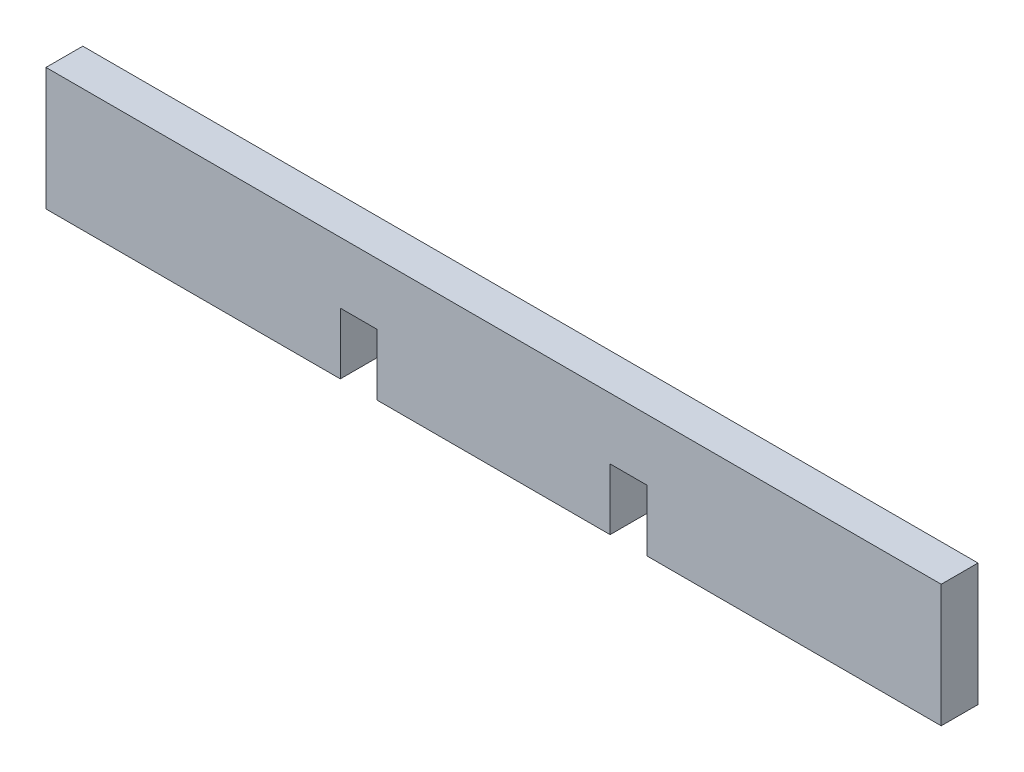
ISO-10303-21;
HEADER;
FILE_DESCRIPTION(('STEP AP214'),'2;1');
FILE_NAME('part.step','',(''),(''),'','','');
FILE_SCHEMA(('AUTOMOTIVE_DESIGN { 1 0 10303 214 1 1 1 1 }'));
ENDSEC;
DATA;
#1=APPLICATION_CONTEXT('core data for automotive mechanical design processes');
#2=APPLICATION_PROTOCOL_DEFINITION('international standard','automotive_design',2000,#1);
#3=PRODUCT_CONTEXT('',#1,'mechanical');
#4=PRODUCT('Part','Part','',(#3));
#5=PRODUCT_RELATED_PRODUCT_CATEGORY('part','',(#4));
#6=PRODUCT_DEFINITION_FORMATION('','',#4);
#7=PRODUCT_DEFINITION_CONTEXT('part definition',#1,'design');
#8=PRODUCT_DEFINITION('design','',#6,#7);
#9=PRODUCT_DEFINITION_SHAPE('','',#8);
#10=(LENGTH_UNIT() NAMED_UNIT(*) SI_UNIT(.MILLI.,.METRE.));
#11=(NAMED_UNIT(*) PLANE_ANGLE_UNIT() SI_UNIT($,.RADIAN.));
#12=(NAMED_UNIT(*) SI_UNIT($,.STERADIAN.) SOLID_ANGLE_UNIT());
#13=UNCERTAINTY_MEASURE_WITH_UNIT(LENGTH_MEASURE(1.E-05),#10,'distance_accuracy_value','');
#14=(GEOMETRIC_REPRESENTATION_CONTEXT(3) GLOBAL_UNCERTAINTY_ASSIGNED_CONTEXT((#13)) GLOBAL_UNIT_ASSIGNED_CONTEXT((#10,
#11,#12)) REPRESENTATION_CONTEXT('',''));
#15=CARTESIAN_POINT('',(0.,0.,0.));
#16=DIRECTION('',(0.,0.,1.));
#17=DIRECTION('',(1.,0.,0.));
#18=AXIS2_PLACEMENT_3D('',#15,#16,#17);
#19=CARTESIAN_POINT('',(-4.09230769230768,0.,3.));
#20=DIRECTION('',(0.,1.,0.));
#21=DIRECTION('',(0.,0.,1.));
#22=AXIS2_PLACEMENT_3D('',#19,#20,#21);
#23=PLANE('',#22);
#24=DIRECTION('',(1.,0.,0.));
#25=VECTOR('',#24,1.);
#26=CARTESIAN_POINT('',(-4.09230769230768,0.,0.));
#27=LINE('',#26,#25);
#28=CARTESIAN_POINT('',(-13.15,0.,0.));
#29=VERTEX_POINT('',#28);
#30=CARTESIAN_POINT('',(5.85,0.,0.));
#31=VERTEX_POINT('',#30);
#32=EDGE_CURVE('E101',#29,#31,#27,.T.);
#33=ORIENTED_EDGE('',*,*,#32,.T.);
#34=DIRECTION('',(0.,0.,-1.));
#35=VECTOR('',#34,1.);
#36=CARTESIAN_POINT('',(5.85,0.,3.));
#37=LINE('',#36,#35);
#38=CARTESIAN_POINT('',(5.85,0.,3.));
#39=VERTEX_POINT('',#38);
#40=EDGE_CURVE('E11',#39,#31,#37,.T.);
#41=ORIENTED_EDGE('',*,*,#40,.F.);
#42=DIRECTION('',(1.,0.,0.));
#43=VECTOR('',#42,1.);
#44=CARTESIAN_POINT('',(-13.15,0.,3.));
#45=LINE('',#44,#43);
#46=CARTESIAN_POINT('',(-13.15,0.,3.));
#47=VERTEX_POINT('',#46);
#48=EDGE_CURVE('E107',#47,#39,#45,.T.);
#49=ORIENTED_EDGE('',*,*,#48,.F.);
#50=DIRECTION('',(0.,0.,-1.));
#51=VECTOR('',#50,1.);
#52=CARTESIAN_POINT('',(-13.15,0.,3.));
#53=LINE('',#52,#51);
#54=EDGE_CURVE('E153',#47,#29,#53,.T.);
#55=ORIENTED_EDGE('',*,*,#54,.T.);
#56=EDGE_LOOP('',(#33,#41,#49,#55));
#57=FACE_BOUND('',#56,.T.);
#58=ADVANCED_FACE('F37',(#57),#23,.F.);
#59=CARTESIAN_POINT('',(5.85,0.,3.));
#60=DIRECTION('',(-1.,0.,0.));
#61=DIRECTION('',(0.,-1.,0.));
#62=AXIS2_PLACEMENT_3D('',#59,#60,#61);
#63=PLANE('',#62);
#64=DIRECTION('',(0.,1.,0.));
#65=VECTOR('',#64,1.);
#66=CARTESIAN_POINT('',(5.85,0.,0.));
#67=LINE('',#66,#65);
#68=CARTESIAN_POINT('',(5.85,5.00000000000001,0.));
#69=VERTEX_POINT('',#68);
#70=EDGE_CURVE('E158',#31,#69,#67,.T.);
#71=ORIENTED_EDGE('',*,*,#70,.T.);
#72=DIRECTION('',(0.,0.,-1.));
#73=VECTOR('',#72,1.);
#74=CARTESIAN_POINT('',(5.85,5.00000000000001,3.));
#75=LINE('',#74,#73);
#76=CARTESIAN_POINT('',(5.85,5.00000000000001,3.));
#77=VERTEX_POINT('',#76);
#78=EDGE_CURVE('E45',#77,#69,#75,.T.);
#79=ORIENTED_EDGE('',*,*,#78,.F.);
#80=DIRECTION('',(0.,1.,0.));
#81=VECTOR('',#80,1.);
#82=CARTESIAN_POINT('',(5.85,0.,3.));
#83=LINE('',#82,#81);
#84=EDGE_CURVE('E246',#39,#77,#83,.T.);
#85=ORIENTED_EDGE('',*,*,#84,.F.);
#86=ORIENTED_EDGE('',*,*,#40,.T.);
#87=EDGE_LOOP('',(#71,#79,#85,#86));
#88=FACE_BOUND('',#87,.T.);
#89=ADVANCED_FACE('F249',(#88),#63,.F.);
#90=CARTESIAN_POINT('',(5.85,5.00000000000001,3.));
#91=DIRECTION('',(0.,1.,0.));
#92=DIRECTION('',(0.,0.,1.));
#93=AXIS2_PLACEMENT_3D('',#90,#91,#92);
#94=PLANE('',#93);
#95=DIRECTION('',(1.,0.,0.));
#96=VECTOR('',#95,1.);
#97=CARTESIAN_POINT('',(5.85,5.00000000000001,0.));
#98=LINE('',#97,#96);
#99=CARTESIAN_POINT('',(8.85,5.00000000000001,0.));
#100=VERTEX_POINT('',#99);
#101=EDGE_CURVE('E160',#69,#100,#98,.T.);
#102=ORIENTED_EDGE('',*,*,#101,.T.);
#103=DIRECTION('',(0.,0.,-1.));
#104=VECTOR('',#103,1.);
#105=CARTESIAN_POINT('',(8.85,5.00000000000001,3.));
#106=LINE('',#105,#104);
#107=CARTESIAN_POINT('',(8.85,5.00000000000001,3.));
#108=VERTEX_POINT('',#107);
#109=EDGE_CURVE('E197',#108,#100,#106,.T.);
#110=ORIENTED_EDGE('',*,*,#109,.F.);
#111=DIRECTION('',(1.,0.,0.));
#112=VECTOR('',#111,1.);
#113=CARTESIAN_POINT('',(5.85,5.00000000000001,3.));
#114=LINE('',#113,#112);
#115=EDGE_CURVE('E206',#77,#108,#114,.T.);
#116=ORIENTED_EDGE('',*,*,#115,.F.);
#117=ORIENTED_EDGE('',*,*,#78,.T.);
#118=EDGE_LOOP('',(#102,#110,#116,#117));
#119=FACE_BOUND('',#118,.T.);
#120=ADVANCED_FACE('F204',(#119),#94,.F.);
#121=CARTESIAN_POINT('',(8.85,5.00000000000001,3.));
#122=DIRECTION('',(1.,0.,0.));
#123=DIRECTION('',(0.,1.,0.));
#124=AXIS2_PLACEMENT_3D('',#121,#122,#123);
#125=PLANE('',#124);
#126=DIRECTION('',(0.,-1.,0.));
#127=VECTOR('',#126,1.);
#128=CARTESIAN_POINT('',(8.85,5.00000000000001,0.));
#129=LINE('',#128,#127);
#130=CARTESIAN_POINT('',(8.85,0.,0.));
#131=VERTEX_POINT('',#130);
#132=EDGE_CURVE('E162',#100,#131,#129,.T.);
#133=ORIENTED_EDGE('',*,*,#132,.T.);
#134=DIRECTION('',(0.,0.,-1.));
#135=VECTOR('',#134,1.);
#136=CARTESIAN_POINT('',(8.85,0.,3.));
#137=LINE('',#136,#135);
#138=CARTESIAN_POINT('',(8.85,0.,3.));
#139=VERTEX_POINT('',#138);
#140=EDGE_CURVE('E194',#139,#131,#137,.T.);
#141=ORIENTED_EDGE('',*,*,#140,.F.);
#142=DIRECTION('',(0.,-1.,0.));
#143=VECTOR('',#142,1.);
#144=CARTESIAN_POINT('',(8.85,5.00000000000001,3.));
#145=LINE('',#144,#143);
#146=EDGE_CURVE('E224',#108,#139,#145,.T.);
#147=ORIENTED_EDGE('',*,*,#146,.F.);
#148=ORIENTED_EDGE('',*,*,#109,.T.);
#149=EDGE_LOOP('',(#133,#141,#147,#148));
#150=FACE_BOUND('',#149,.T.);
#151=ADVANCED_FACE('F215',(#150),#125,.F.);
#152=CARTESIAN_POINT('',(8.85,0.,3.));
#153=DIRECTION('',(0.,1.,0.));
#154=DIRECTION('',(-1.,0.,0.));
#155=AXIS2_PLACEMENT_3D('',#152,#153,#154);
#156=PLANE('',#155);
#157=DIRECTION('',(1.,0.,0.));
#158=VECTOR('',#157,1.);
#159=CARTESIAN_POINT('',(8.85,0.,0.));
#160=LINE('',#159,#158);
#161=CARTESIAN_POINT('',(32.85,0.,0.));
#162=VERTEX_POINT('',#161);
#163=EDGE_CURVE('E164',#131,#162,#160,.T.);
#164=ORIENTED_EDGE('',*,*,#163,.T.);
#165=DIRECTION('',(0.,0.,-1.));
#166=VECTOR('',#165,1.);
#167=CARTESIAN_POINT('',(32.85,0.,3.));
#168=LINE('',#167,#166);
#169=CARTESIAN_POINT('',(32.85,0.,3.));
#170=VERTEX_POINT('',#169);
#171=EDGE_CURVE('E191',#170,#162,#168,.T.);
#172=ORIENTED_EDGE('',*,*,#171,.F.);
#173=DIRECTION('',(1.,0.,0.));
#174=VECTOR('',#173,1.);
#175=CARTESIAN_POINT('',(8.85,0.,3.));
#176=LINE('',#175,#174);
#177=EDGE_CURVE('E221',#139,#170,#176,.T.);
#178=ORIENTED_EDGE('',*,*,#177,.F.);
#179=ORIENTED_EDGE('',*,*,#140,.T.);
#180=EDGE_LOOP('',(#164,#172,#178,#179));
#181=FACE_BOUND('',#180,.T.);
#182=ADVANCED_FACE('F219',(#181),#156,.F.);
#183=CARTESIAN_POINT('',(32.85,0.,3.));
#184=DIRECTION('',(-1.,0.,0.));
#185=DIRECTION('',(0.,0.,1.));
#186=AXIS2_PLACEMENT_3D('',#183,#184,#185);
#187=PLANE('',#186);
#188=DIRECTION('',(0.,1.,0.));
#189=VECTOR('',#188,1.);
#190=CARTESIAN_POINT('',(32.85,0.,0.));
#191=LINE('',#190,#189);
#192=CARTESIAN_POINT('',(32.85,10.,0.));
#193=VERTEX_POINT('',#192);
#194=EDGE_CURVE('E166',#162,#193,#191,.T.);
#195=ORIENTED_EDGE('',*,*,#194,.T.);
#196=DIRECTION('',(0.,0.,-1.));
#197=VECTOR('',#196,1.);
#198=CARTESIAN_POINT('',(32.85,10.,3.));
#199=LINE('',#198,#197);
#200=CARTESIAN_POINT('',(32.85,10.,3.));
#201=VERTEX_POINT('',#200);
#202=EDGE_CURVE('E188',#201,#193,#199,.T.);
#203=ORIENTED_EDGE('',*,*,#202,.F.);
#204=DIRECTION('',(0.,1.,0.));
#205=VECTOR('',#204,1.);
#206=CARTESIAN_POINT('',(32.85,0.,3.));
#207=LINE('',#206,#205);
#208=EDGE_CURVE('E223',#170,#201,#207,.T.);
#209=ORIENTED_EDGE('',*,*,#208,.F.);
#210=ORIENTED_EDGE('',*,*,#171,.T.);
#211=EDGE_LOOP('',(#195,#203,#209,#210));
#212=FACE_BOUND('',#211,.T.);
#213=ADVANCED_FACE('F261',(#212),#187,.F.);
#214=CARTESIAN_POINT('',(32.85,10.,3.));
#215=DIRECTION('',(0.,-1.,0.));
#216=DIRECTION('',(1.,0.,0.));
#217=AXIS2_PLACEMENT_3D('',#214,#215,#216);
#218=PLANE('',#217);
#219=DIRECTION('',(-1.,0.,0.));
#220=VECTOR('',#219,1.);
#221=CARTESIAN_POINT('',(32.85,10.,0.));
#222=LINE('',#221,#220);
#223=CARTESIAN_POINT('',(-40.15,9.99999999999999,0.));
#224=VERTEX_POINT('',#223);
#225=EDGE_CURVE('E168',#193,#224,#222,.T.);
#226=ORIENTED_EDGE('',*,*,#225,.T.);
#227=DIRECTION('',(0.,0.,-1.));
#228=VECTOR('',#227,1.);
#229=CARTESIAN_POINT('',(-40.15,9.99999999999999,3.));
#230=LINE('',#229,#228);
#231=CARTESIAN_POINT('',(-40.15,9.99999999999999,3.));
#232=VERTEX_POINT('',#231);
#233=EDGE_CURVE('E185',#232,#224,#230,.T.);
#234=ORIENTED_EDGE('',*,*,#233,.F.);
#235=DIRECTION('',(-1.,0.,0.));
#236=VECTOR('',#235,1.);
#237=CARTESIAN_POINT('',(32.85,10.,3.));
#238=LINE('',#237,#236);
#239=EDGE_CURVE('E226',#201,#232,#238,.T.);
#240=ORIENTED_EDGE('',*,*,#239,.F.);
#241=ORIENTED_EDGE('',*,*,#202,.T.);
#242=EDGE_LOOP('',(#226,#234,#240,#241));
#243=FACE_BOUND('',#242,.T.);
#244=ADVANCED_FACE('F264',(#243),#218,.F.);
#245=CARTESIAN_POINT('',(-40.15,9.99999999999999,3.));
#246=DIRECTION('',(1.,0.,0.));
#247=DIRECTION('',(0.,0.,-1.));
#248=AXIS2_PLACEMENT_3D('',#245,#246,#247);
#249=PLANE('',#248);
#250=DIRECTION('',(0.,-1.,0.));
#251=VECTOR('',#250,1.);
#252=CARTESIAN_POINT('',(-40.15,9.99999999999999,0.));
#253=LINE('',#252,#251);
#254=CARTESIAN_POINT('',(-40.15,0.,0.));
#255=VERTEX_POINT('',#254);
#256=EDGE_CURVE('E170',#224,#255,#253,.T.);
#257=ORIENTED_EDGE('',*,*,#256,.T.);
#258=DIRECTION('',(0.,0.,-1.));
#259=VECTOR('',#258,1.);
#260=CARTESIAN_POINT('',(-40.15,0.,3.));
#261=LINE('',#260,#259);
#262=CARTESIAN_POINT('',(-40.15,0.,3.));
#263=VERTEX_POINT('',#262);
#264=EDGE_CURVE('E182',#263,#255,#261,.T.);
#265=ORIENTED_EDGE('',*,*,#264,.F.);
#266=DIRECTION('',(0.,-1.,0.));
#267=VECTOR('',#266,1.);
#268=CARTESIAN_POINT('',(-40.15,9.99999999999999,3.));
#269=LINE('',#268,#267);
#270=EDGE_CURVE('E232',#232,#263,#269,.T.);
#271=ORIENTED_EDGE('',*,*,#270,.F.);
#272=ORIENTED_EDGE('',*,*,#233,.T.);
#273=EDGE_LOOP('',(#257,#265,#271,#272));
#274=FACE_BOUND('',#273,.T.);
#275=ADVANCED_FACE('F238',(#274),#249,.F.);
#276=CARTESIAN_POINT('',(-40.15,0.,3.));
#277=DIRECTION('',(0.,1.,0.));
#278=DIRECTION('',(0.,0.,1.));
#279=AXIS2_PLACEMENT_3D('',#276,#277,#278);
#280=PLANE('',#279);
#281=DIRECTION('',(1.,0.,0.));
#282=VECTOR('',#281,1.);
#283=CARTESIAN_POINT('',(-40.15,0.,0.));
#284=LINE('',#283,#282);
#285=CARTESIAN_POINT('',(-16.15,0.,0.));
#286=VERTEX_POINT('',#285);
#287=EDGE_CURVE('E172',#255,#286,#284,.T.);
#288=ORIENTED_EDGE('',*,*,#287,.T.);
#289=DIRECTION('',(0.,0.,-1.));
#290=VECTOR('',#289,1.);
#291=CARTESIAN_POINT('',(-16.15,0.,3.));
#292=LINE('',#291,#290);
#293=CARTESIAN_POINT('',(-16.15,0.,3.));
#294=VERTEX_POINT('',#293);
#295=EDGE_CURVE('E148',#294,#286,#292,.T.);
#296=ORIENTED_EDGE('',*,*,#295,.F.);
#297=DIRECTION('',(1.,0.,0.));
#298=VECTOR('',#297,1.);
#299=CARTESIAN_POINT('',(-40.15,0.,3.));
#300=LINE('',#299,#298);
#301=EDGE_CURVE('E139',#263,#294,#300,.T.);
#302=ORIENTED_EDGE('',*,*,#301,.F.);
#303=ORIENTED_EDGE('',*,*,#264,.T.);
#304=EDGE_LOOP('',(#288,#296,#302,#303));
#305=FACE_BOUND('',#304,.T.);
#306=ADVANCED_FACE('F242',(#305),#280,.F.);
#307=CARTESIAN_POINT('',(-16.15,0.,3.));
#308=DIRECTION('',(-1.,0.,0.));
#309=DIRECTION('',(0.,0.,1.));
#310=AXIS2_PLACEMENT_3D('',#307,#308,#309);
#311=PLANE('',#310);
#312=DIRECTION('',(0.,1.,0.));
#313=VECTOR('',#312,1.);
#314=CARTESIAN_POINT('',(-16.15,0.,0.));
#315=LINE('',#314,#313);
#316=CARTESIAN_POINT('',(-16.15,5.,0.));
#317=VERTEX_POINT('',#316);
#318=EDGE_CURVE('E147',#286,#317,#315,.T.);
#319=ORIENTED_EDGE('',*,*,#318,.T.);
#320=DIRECTION('',(0.,0.,-1.));
#321=VECTOR('',#320,1.);
#322=CARTESIAN_POINT('',(-16.15,5.,3.));
#323=LINE('',#322,#321);
#324=CARTESIAN_POINT('',(-16.15,5.,3.));
#325=VERTEX_POINT('',#324);
#326=EDGE_CURVE('E144',#325,#317,#323,.T.);
#327=ORIENTED_EDGE('',*,*,#326,.F.);
#328=DIRECTION('',(0.,1.,0.));
#329=VECTOR('',#328,1.);
#330=CARTESIAN_POINT('',(-16.15,0.,3.));
#331=LINE('',#330,#329);
#332=EDGE_CURVE('E133',#294,#325,#331,.T.);
#333=ORIENTED_EDGE('',*,*,#332,.F.);
#334=ORIENTED_EDGE('',*,*,#295,.T.);
#335=EDGE_LOOP('',(#319,#327,#333,#334));
#336=FACE_BOUND('',#335,.T.);
#337=ADVANCED_FACE('F145',(#336),#311,.F.);
#338=CARTESIAN_POINT('',(-16.15,5.,3.));
#339=DIRECTION('',(0.,1.,0.));
#340=DIRECTION('',(0.,0.,1.));
#341=AXIS2_PLACEMENT_3D('',#338,#339,#340);
#342=PLANE('',#341);
#343=DIRECTION('',(1.,0.,0.));
#344=VECTOR('',#343,1.);
#345=CARTESIAN_POINT('',(-16.15,5.,0.));
#346=LINE('',#345,#344);
#347=CARTESIAN_POINT('',(-13.15,5.,0.));
#348=VERTEX_POINT('',#347);
#349=EDGE_CURVE('E94',#317,#348,#346,.T.);
#350=ORIENTED_EDGE('',*,*,#349,.T.);
#351=DIRECTION('',(0.,0.,-1.));
#352=VECTOR('',#351,1.);
#353=CARTESIAN_POINT('',(-13.15,5.,3.));
#354=LINE('',#353,#352);
#355=CARTESIAN_POINT('',(-13.15,5.,3.));
#356=VERTEX_POINT('',#355);
#357=EDGE_CURVE('E149',#356,#348,#354,.T.);
#358=ORIENTED_EDGE('',*,*,#357,.F.);
#359=DIRECTION('',(1.,0.,0.));
#360=VECTOR('',#359,1.);
#361=CARTESIAN_POINT('',(-16.15,5.,3.));
#362=LINE('',#361,#360);
#363=EDGE_CURVE('E137',#325,#356,#362,.T.);
#364=ORIENTED_EDGE('',*,*,#363,.F.);
#365=ORIENTED_EDGE('',*,*,#326,.T.);
#366=EDGE_LOOP('',(#350,#358,#364,#365));
#367=FACE_BOUND('',#366,.T.);
#368=ADVANCED_FACE('F151',(#367),#342,.F.);
#369=CARTESIAN_POINT('',(-13.15,5.,3.));
#370=DIRECTION('',(1.,0.,0.));
#371=DIRECTION('',(0.,0.,-1.));
#372=AXIS2_PLACEMENT_3D('',#369,#370,#371);
#373=PLANE('',#372);
#374=DIRECTION('',(0.,-1.,0.));
#375=VECTOR('',#374,1.);
#376=CARTESIAN_POINT('',(-13.15,5.,0.));
#377=LINE('',#376,#375);
#378=EDGE_CURVE('E176',#348,#29,#377,.T.);
#379=ORIENTED_EDGE('',*,*,#378,.T.);
#380=ORIENTED_EDGE('',*,*,#54,.F.);
#381=DIRECTION('',(0.,-1.,0.));
#382=VECTOR('',#381,1.);
#383=CARTESIAN_POINT('',(-13.15,5.,3.));
#384=LINE('',#383,#382);
#385=EDGE_CURVE('E53',#356,#47,#384,.T.);
#386=ORIENTED_EDGE('',*,*,#385,.F.);
#387=ORIENTED_EDGE('',*,*,#357,.T.);
#388=EDGE_LOOP('',(#379,#380,#386,#387));
#389=FACE_BOUND('',#388,.T.);
#390=ADVANCED_FACE('F244',(#389),#373,.F.);
#391=CARTESIAN_POINT('',(0.,0.,3.));
#392=DIRECTION('',(0.,0.,1.));
#393=DIRECTION('',(1.,0.,0.));
#394=AXIS2_PLACEMENT_3D('',#391,#392,#393);
#395=PLANE('',#394);
#396=ORIENTED_EDGE('',*,*,#48,.T.);
#397=ORIENTED_EDGE('',*,*,#84,.T.);
#398=ORIENTED_EDGE('',*,*,#115,.T.);
#399=ORIENTED_EDGE('',*,*,#146,.T.);
#400=ORIENTED_EDGE('',*,*,#177,.T.);
#401=ORIENTED_EDGE('',*,*,#208,.T.);
#402=ORIENTED_EDGE('',*,*,#239,.T.);
#403=ORIENTED_EDGE('',*,*,#270,.T.);
#404=ORIENTED_EDGE('',*,*,#301,.T.);
#405=ORIENTED_EDGE('',*,*,#332,.T.);
#406=ORIENTED_EDGE('',*,*,#363,.T.);
#407=ORIENTED_EDGE('',*,*,#385,.T.);
#408=EDGE_LOOP('',(#396,#397,#398,#399,#400,#401,#402,#403,#404,#405,#406,#407));
#409=FACE_BOUND('',#408,.T.);
#410=ADVANCED_FACE('F135',(#409),#395,.T.);
#411=CARTESIAN_POINT('',(0.,0.,0.));
#412=DIRECTION('',(0.,0.,1.));
#413=DIRECTION('',(1.,0.,0.));
#414=AXIS2_PLACEMENT_3D('',#411,#412,#413);
#415=PLANE('',#414);
#416=ORIENTED_EDGE('',*,*,#32,.F.);
#417=ORIENTED_EDGE('',*,*,#378,.F.);
#418=ORIENTED_EDGE('',*,*,#349,.F.);
#419=ORIENTED_EDGE('',*,*,#318,.F.);
#420=ORIENTED_EDGE('',*,*,#287,.F.);
#421=ORIENTED_EDGE('',*,*,#256,.F.);
#422=ORIENTED_EDGE('',*,*,#225,.F.);
#423=ORIENTED_EDGE('',*,*,#194,.F.);
#424=ORIENTED_EDGE('',*,*,#163,.F.);
#425=ORIENTED_EDGE('',*,*,#132,.F.);
#426=ORIENTED_EDGE('',*,*,#101,.F.);
#427=ORIENTED_EDGE('',*,*,#70,.F.);
#428=EDGE_LOOP('',(#416,#417,#418,#419,#420,#421,#422,#423,#424,#425,#426,#427));
#429=FACE_BOUND('',#428,.T.);
#430=ADVANCED_FACE('F210',(#429),#415,.F.);
#431=CLOSED_SHELL('',(#58,#89,#120,#151,#182,#213,#244,#275,#306,#337,#368,#390,#410,#430));
#432=MANIFOLD_SOLID_BREP('B2',#431);
#433=ADVANCED_BREP_SHAPE_REPRESENTATION('',(#18,#432),#14);
#434=SHAPE_DEFINITION_REPRESENTATION(#9,#433);
ENDSEC;
END-ISO-10303-21;
